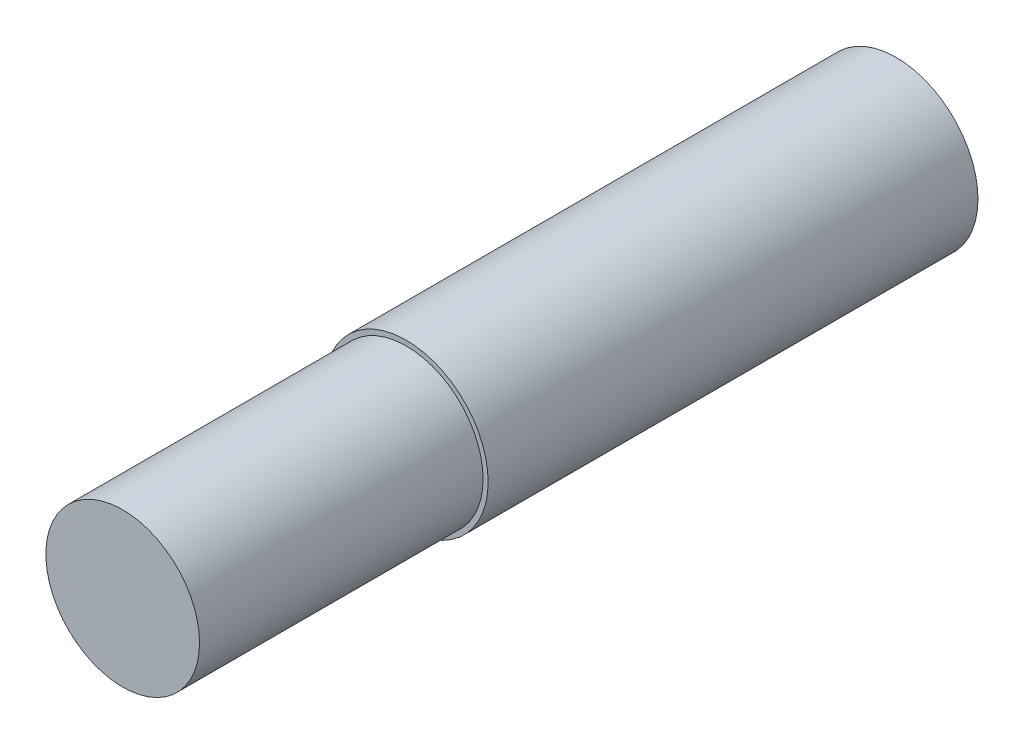
ISO-10303-21;
HEADER;
FILE_DESCRIPTION(('STEP AP214'),'2;1');
FILE_NAME('part.step','',(''),(''),'','','');
FILE_SCHEMA(('AUTOMOTIVE_DESIGN { 1 0 10303 214 1 1 1 1 }'));
ENDSEC;
DATA;
#1=APPLICATION_CONTEXT('core data for automotive mechanical design processes');
#2=APPLICATION_PROTOCOL_DEFINITION('international standard','automotive_design',2000,#1);
#3=PRODUCT_CONTEXT('',#1,'mechanical');
#4=PRODUCT('Part','Part','',(#3));
#5=PRODUCT_RELATED_PRODUCT_CATEGORY('part','',(#4));
#6=PRODUCT_DEFINITION_FORMATION('','',#4);
#7=PRODUCT_DEFINITION_CONTEXT('part definition',#1,'design');
#8=PRODUCT_DEFINITION('design','',#6,#7);
#9=PRODUCT_DEFINITION_SHAPE('','',#8);
#10=(LENGTH_UNIT() NAMED_UNIT(*) SI_UNIT(.MILLI.,.METRE.));
#11=(NAMED_UNIT(*) PLANE_ANGLE_UNIT() SI_UNIT($,.RADIAN.));
#12=(NAMED_UNIT(*) SI_UNIT($,.STERADIAN.) SOLID_ANGLE_UNIT());
#13=UNCERTAINTY_MEASURE_WITH_UNIT(LENGTH_MEASURE(1.E-05),#10,'distance_accuracy_value','');
#14=(GEOMETRIC_REPRESENTATION_CONTEXT(3) GLOBAL_UNCERTAINTY_ASSIGNED_CONTEXT((#13)) GLOBAL_UNIT_ASSIGNED_CONTEXT((#10,
#11,#12)) REPRESENTATION_CONTEXT('',''));
#15=CARTESIAN_POINT('',(0.,0.,0.));
#16=DIRECTION('',(0.,0.,1.));
#17=DIRECTION('',(1.,0.,0.));
#18=AXIS2_PLACEMENT_3D('',#15,#16,#17);
#19=CARTESIAN_POINT('',(0.,0.,19.));
#20=DIRECTION('',(0.,0.,-1.));
#21=DIRECTION('',(-1.,0.,0.));
#22=AXIS2_PLACEMENT_3D('',#19,#20,#21);
#23=CYLINDRICAL_SURFACE('',#22,3.175);
#24=CARTESIAN_POINT('',(0.,0.,19.));
#25=DIRECTION('',(0.,0.,1.));
#26=DIRECTION('',(1.,0.,0.));
#27=AXIS2_PLACEMENT_3D('',#24,#25,#26);
#28=CIRCLE('',#27,3.175);
#29=CARTESIAN_POINT('',(3.175,0.,19.));
#30=VERTEX_POINT('',#29);
#31=EDGE_CURVE('E40',#30,#30,#28,.T.);
#32=ORIENTED_EDGE('',*,*,#31,.F.);
#33=EDGE_LOOP('',(#32));
#34=FACE_BOUND('',#33,.T.);
#35=CARTESIAN_POINT('',(0.,0.,0.));
#36=DIRECTION('',(0.,0.,1.));
#37=DIRECTION('',(1.,0.,0.));
#38=AXIS2_PLACEMENT_3D('',#35,#36,#37);
#39=CIRCLE('',#38,3.175);
#40=CARTESIAN_POINT('',(3.175,0.,0.));
#41=VERTEX_POINT('',#40);
#42=EDGE_CURVE('E36',#41,#41,#39,.T.);
#43=ORIENTED_EDGE('',*,*,#42,.T.);
#44=EDGE_LOOP('',(#43));
#45=FACE_BOUND('',#44,.T.);
#46=ADVANCED_FACE('F33',(#34,#45),#23,.T.);
#47=CARTESIAN_POINT('',(0.,0.,19.));
#48=DIRECTION('',(0.,0.,1.));
#49=DIRECTION('',(1.,0.,0.));
#50=AXIS2_PLACEMENT_3D('',#47,#48,#49);
#51=PLANE('',#50);
#52=CARTESIAN_POINT('',(0.,0.,19.));
#53=DIRECTION('',(0.,0.,1.));
#54=DIRECTION('',(1.,0.,0.));
#55=AXIS2_PLACEMENT_3D('',#52,#53,#54);
#56=CIRCLE('',#55,2.98);
#57=CARTESIAN_POINT('',(2.98,0.,19.));
#58=VERTEX_POINT('',#57);
#59=EDGE_CURVE('E10',#58,#58,#56,.T.);
#60=ORIENTED_EDGE('',*,*,#59,.F.);
#61=EDGE_LOOP('',(#60));
#62=FACE_BOUND('',#61,.T.);
#63=ORIENTED_EDGE('',*,*,#31,.T.);
#64=EDGE_LOOP('',(#63));
#65=FACE_BOUND('',#64,.T.);
#66=ADVANCED_FACE('F57',(#62,#65),#51,.T.);
#67=CARTESIAN_POINT('',(0.,0.,0.));
#68=DIRECTION('',(0.,0.,1.));
#69=DIRECTION('',(1.,0.,0.));
#70=AXIS2_PLACEMENT_3D('',#67,#68,#69);
#71=PLANE('',#70);
#72=ORIENTED_EDGE('',*,*,#42,.F.);
#73=EDGE_LOOP('',(#72));
#74=FACE_BOUND('',#73,.T.);
#75=ADVANCED_FACE('F54',(#74),#71,.F.);
#76=CARTESIAN_POINT('',(0.,0.,30.));
#77=DIRECTION('',(0.,0.,-1.));
#78=DIRECTION('',(-1.,0.,0.));
#79=AXIS2_PLACEMENT_3D('',#76,#77,#78);
#80=CYLINDRICAL_SURFACE('',#79,2.98);
#81=CARTESIAN_POINT('',(0.,0.,30.));
#82=DIRECTION('',(0.,0.,1.));
#83=DIRECTION('',(1.,0.,0.));
#84=AXIS2_PLACEMENT_3D('',#81,#82,#83);
#85=CIRCLE('',#84,2.98);
#86=CARTESIAN_POINT('',(2.98,0.,30.));
#87=VERTEX_POINT('',#86);
#88=EDGE_CURVE('E46',#87,#87,#85,.T.);
#89=ORIENTED_EDGE('',*,*,#88,.F.);
#90=EDGE_LOOP('',(#89));
#91=FACE_BOUND('',#90,.T.);
#92=ORIENTED_EDGE('',*,*,#59,.T.);
#93=EDGE_LOOP('',(#92));
#94=FACE_BOUND('',#93,.T.);
#95=ADVANCED_FACE('F56',(#91,#94),#80,.T.);
#96=CARTESIAN_POINT('',(0.,0.,30.));
#97=DIRECTION('',(0.,0.,1.));
#98=DIRECTION('',(1.,0.,0.));
#99=AXIS2_PLACEMENT_3D('',#96,#97,#98);
#100=PLANE('',#99);
#101=ORIENTED_EDGE('',*,*,#88,.T.);
#102=EDGE_LOOP('',(#101));
#103=FACE_BOUND('',#102,.T.);
#104=ADVANCED_FACE('F62',(#103),#100,.T.);
#105=CLOSED_SHELL('',(#46,#66,#75,#95,#104));
#106=MANIFOLD_SOLID_BREP('B2',#105);
#107=ADVANCED_BREP_SHAPE_REPRESENTATION('',(#18,#106),#14);
#108=SHAPE_DEFINITION_REPRESENTATION(#9,#107);
ENDSEC;
END-ISO-10303-21;
